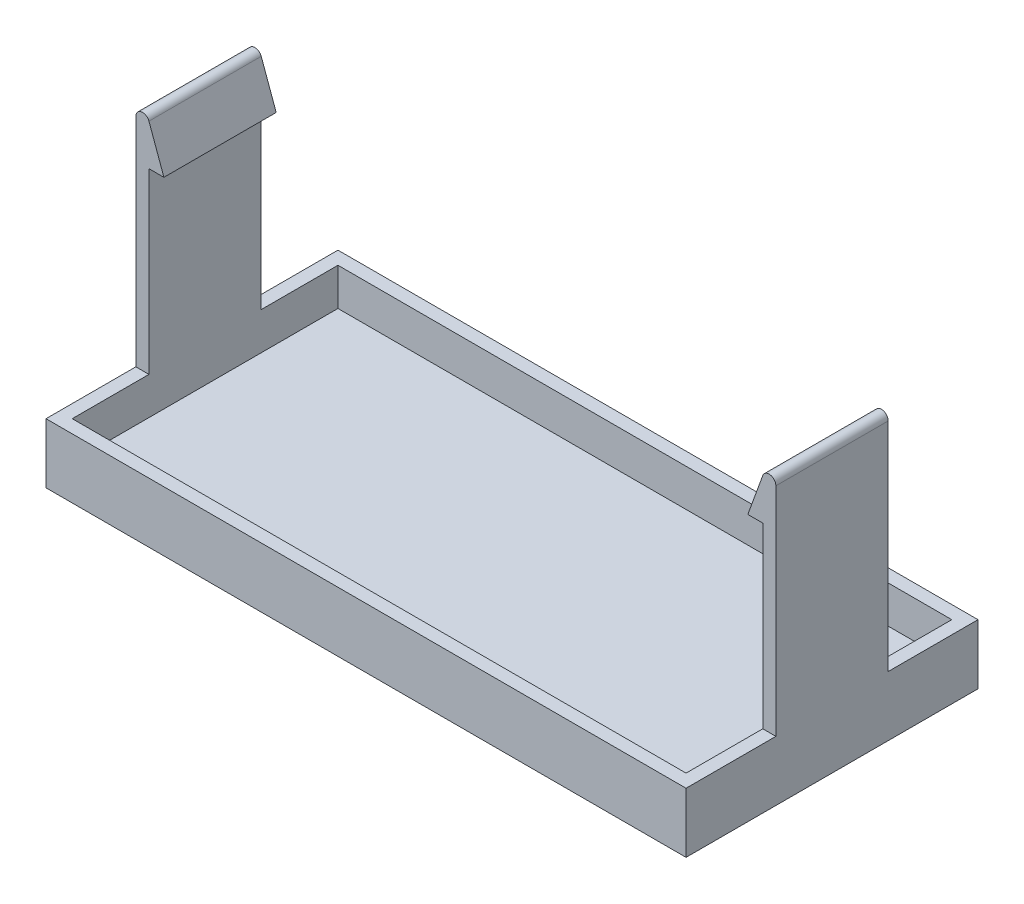
ISO-10303-21;
HEADER;
FILE_DESCRIPTION(('STEP AP214'),'2;1');
FILE_NAME('part.step','',(''),(''),'','','');
FILE_SCHEMA(('AUTOMOTIVE_DESIGN { 1 0 10303 214 1 1 1 1 }'));
ENDSEC;
DATA;
#1=APPLICATION_CONTEXT('core data for automotive mechanical design processes');
#2=APPLICATION_PROTOCOL_DEFINITION('international standard','automotive_design',2000,#1);
#3=PRODUCT_CONTEXT('',#1,'mechanical');
#4=PRODUCT('Part','Part','',(#3));
#5=PRODUCT_RELATED_PRODUCT_CATEGORY('part','',(#4));
#6=PRODUCT_DEFINITION_FORMATION('','',#4);
#7=PRODUCT_DEFINITION_CONTEXT('part definition',#1,'design');
#8=PRODUCT_DEFINITION('design','',#6,#7);
#9=PRODUCT_DEFINITION_SHAPE('','',#8);
#10=(LENGTH_UNIT() NAMED_UNIT(*) SI_UNIT(.MILLI.,.METRE.));
#11=(NAMED_UNIT(*) PLANE_ANGLE_UNIT() SI_UNIT($,.RADIAN.));
#12=(NAMED_UNIT(*) SI_UNIT($,.STERADIAN.) SOLID_ANGLE_UNIT());
#13=UNCERTAINTY_MEASURE_WITH_UNIT(LENGTH_MEASURE(1.E-05),#10,'distance_accuracy_value','');
#14=(GEOMETRIC_REPRESENTATION_CONTEXT(3) GLOBAL_UNCERTAINTY_ASSIGNED_CONTEXT((#13)) GLOBAL_UNIT_ASSIGNED_CONTEXT((#10,
#11,#12)) REPRESENTATION_CONTEXT('',''));
#15=CARTESIAN_POINT('',(0.,0.,0.));
#16=DIRECTION('',(0.,0.,1.));
#17=DIRECTION('',(1.,0.,0.));
#18=AXIS2_PLACEMENT_3D('',#15,#16,#17);
#19=CARTESIAN_POINT('',(0.,8.,0.));
#20=DIRECTION('',(0.,1.,0.));
#21=DIRECTION('',(0.,0.,1.));
#22=AXIS2_PLACEMENT_3D('',#19,#20,#21);
#23=PLANE('',#22);
#24=DIRECTION('',(0.,0.,-1.));
#25=VECTOR('',#24,1.);
#26=CARTESIAN_POINT('',(83.75,8.,-37.25));
#27=LINE('',#26,#25);
#28=CARTESIAN_POINT('',(83.75,8.,-27.));
#29=VERTEX_POINT('',#28);
#30=CARTESIAN_POINT('',(83.75,8.,-37.25));
#31=VERTEX_POINT('',#30);
#32=EDGE_CURVE('E309',#29,#31,#27,.T.);
#33=ORIENTED_EDGE('',*,*,#32,.F.);
#34=DIRECTION('',(-1.,0.,0.));
#35=VECTOR('',#34,1.);
#36=CARTESIAN_POINT('',(85.5,8.,-27.));
#37=LINE('',#36,#35);
#38=CARTESIAN_POINT('',(85.5,8.,-27.));
#39=VERTEX_POINT('',#38);
#40=EDGE_CURVE('E55',#39,#29,#37,.T.);
#41=ORIENTED_EDGE('',*,*,#40,.F.);
#42=DIRECTION('',(0.,0.,-1.));
#43=VECTOR('',#42,1.);
#44=CARTESIAN_POINT('',(85.5,8.,-39.));
#45=LINE('',#44,#43);
#46=CARTESIAN_POINT('',(85.5,8.,-39.));
#47=VERTEX_POINT('',#46);
#48=EDGE_CURVE('E353',#39,#47,#45,.T.);
#49=ORIENTED_EDGE('',*,*,#48,.T.);
#50=DIRECTION('',(-1.,0.,0.));
#51=VECTOR('',#50,1.);
#52=CARTESIAN_POINT('',(0.,8.,-39.));
#53=LINE('',#52,#51);
#54=CARTESIAN_POINT('',(0.,8.,-39.));
#55=VERTEX_POINT('',#54);
#56=EDGE_CURVE('E358',#47,#55,#53,.T.);
#57=ORIENTED_EDGE('',*,*,#56,.T.);
#58=DIRECTION('',(0.,0.,1.));
#59=VECTOR('',#58,1.);
#60=CARTESIAN_POINT('',(0.,8.,-39.));
#61=LINE('',#60,#59);
#62=CARTESIAN_POINT('',(0.,8.,-27.));
#63=VERTEX_POINT('',#62);
#64=EDGE_CURVE('E346',#55,#63,#61,.T.);
#65=ORIENTED_EDGE('',*,*,#64,.T.);
#66=DIRECTION('',(-1.,0.,0.));
#67=VECTOR('',#66,1.);
#68=CARTESIAN_POINT('',(0.,8.,-27.));
#69=LINE('',#68,#67);
#70=CARTESIAN_POINT('',(1.75,8.,-27.));
#71=VERTEX_POINT('',#70);
#72=EDGE_CURVE('E63',#71,#63,#69,.T.);
#73=ORIENTED_EDGE('',*,*,#72,.F.);
#74=DIRECTION('',(0.,0.,1.));
#75=VECTOR('',#74,1.);
#76=CARTESIAN_POINT('',(1.75,8.,-37.25));
#77=LINE('',#76,#75);
#78=CARTESIAN_POINT('',(1.75,8.,-37.25));
#79=VERTEX_POINT('',#78);
#80=EDGE_CURVE('E302',#79,#71,#77,.T.);
#81=ORIENTED_EDGE('',*,*,#80,.F.);
#82=DIRECTION('',(-1.,0.,0.));
#83=VECTOR('',#82,1.);
#84=CARTESIAN_POINT('',(1.75,8.,-37.25));
#85=LINE('',#84,#83);
#86=EDGE_CURVE('E314',#31,#79,#85,.T.);
#87=ORIENTED_EDGE('',*,*,#86,.F.);
#88=EDGE_LOOP('',(#33,#41,#49,#57,#65,#73,#81,#87));
#89=FACE_BOUND('',#88,.T.);
#90=ADVANCED_FACE('F39',(#89),#23,.T.);
#91=CARTESIAN_POINT('',(85.5,8.,0.));
#92=VERTEX_POINT('',#91);
#93=CARTESIAN_POINT('',(85.5,8.,-12.));
#94=VERTEX_POINT('',#93);
#95=EDGE_CURVE('E354',#92,#94,#45,.T.);
#96=ORIENTED_EDGE('',*,*,#95,.T.);
#97=DIRECTION('',(1.,0.,0.));
#98=VECTOR('',#97,1.);
#99=CARTESIAN_POINT('',(85.5,8.,-12.));
#100=LINE('',#99,#98);
#101=CARTESIAN_POINT('',(83.75,8.,-12.));
#102=VERTEX_POINT('',#101);
#103=EDGE_CURVE('E260',#102,#94,#100,.T.);
#104=ORIENTED_EDGE('',*,*,#103,.F.);
#105=CARTESIAN_POINT('',(83.75,8.,-1.75000000000002));
#106=VERTEX_POINT('',#105);
#107=EDGE_CURVE('E310',#106,#102,#27,.T.);
#108=ORIENTED_EDGE('',*,*,#107,.F.);
#109=DIRECTION('',(1.,0.,0.));
#110=VECTOR('',#109,1.);
#111=CARTESIAN_POINT('',(1.75,8.,-1.75000000000001));
#112=LINE('',#111,#110);
#113=CARTESIAN_POINT('',(1.75,8.,-1.75000000000001));
#114=VERTEX_POINT('',#113);
#115=EDGE_CURVE('E305',#114,#106,#112,.T.);
#116=ORIENTED_EDGE('',*,*,#115,.F.);
#117=CARTESIAN_POINT('',(1.75,8.,-12.));
#118=VERTEX_POINT('',#117);
#119=EDGE_CURVE('E306',#118,#114,#77,.T.);
#120=ORIENTED_EDGE('',*,*,#119,.F.);
#121=DIRECTION('',(1.,0.,0.));
#122=VECTOR('',#121,1.);
#123=CARTESIAN_POINT('',(0.,8.,-12.));
#124=LINE('',#123,#122);
#125=CARTESIAN_POINT('',(0.,8.,-12.));
#126=VERTEX_POINT('',#125);
#127=EDGE_CURVE('E275',#126,#118,#124,.T.);
#128=ORIENTED_EDGE('',*,*,#127,.F.);
#129=CARTESIAN_POINT('',(0.,8.,0.));
#130=VERTEX_POINT('',#129);
#131=EDGE_CURVE('E345',#126,#130,#61,.T.);
#132=ORIENTED_EDGE('',*,*,#131,.T.);
#133=DIRECTION('',(1.,0.,0.));
#134=VECTOR('',#133,1.);
#135=CARTESIAN_POINT('',(0.,8.,0.));
#136=LINE('',#135,#134);
#137=EDGE_CURVE('E349',#130,#92,#136,.T.);
#138=ORIENTED_EDGE('',*,*,#137,.T.);
#139=EDGE_LOOP('',(#96,#104,#108,#116,#120,#128,#132,#138));
#140=FACE_BOUND('',#139,.T.);
#141=ADVANCED_FACE('F427',(#140),#23,.T.);
#142=CARTESIAN_POINT('',(0.,3.,0.));
#143=DIRECTION('',(1.,0.,0.));
#144=DIRECTION('',(0.,0.,-1.));
#145=AXIS2_PLACEMENT_3D('',#142,#143,#144);
#146=PLANE('',#145);
#147=DIRECTION('',(0.,0.,1.));
#148=VECTOR('',#147,1.);
#149=CARTESIAN_POINT('',(0.,0.,0.));
#150=LINE('',#149,#148);
#151=CARTESIAN_POINT('',(0.,0.,-39.));
#152=VERTEX_POINT('',#151);
#153=CARTESIAN_POINT('',(0.,0.,0.));
#154=VERTEX_POINT('',#153);
#155=EDGE_CURVE('E362',#152,#154,#150,.T.);
#156=ORIENTED_EDGE('',*,*,#155,.T.);
#157=DIRECTION('',(0.,-1.,0.));
#158=VECTOR('',#157,1.);
#159=CARTESIAN_POINT('',(0.,3.,0.));
#160=LINE('',#159,#158);
#161=EDGE_CURVE('E11',#130,#154,#160,.T.);
#162=ORIENTED_EDGE('',*,*,#161,.F.);
#163=ORIENTED_EDGE('',*,*,#131,.F.);
#164=DIRECTION('',(0.,-1.,0.));
#165=VECTOR('',#164,1.);
#166=CARTESIAN_POINT('',(0.,31.8,-12.));
#167=LINE('',#166,#165);
#168=CARTESIAN_POINT('',(0.,36.9863826226695,-12.));
#169=VERTEX_POINT('',#168);
#170=EDGE_CURVE('E297',#169,#126,#167,.T.);
#171=ORIENTED_EDGE('',*,*,#170,.F.);
#172=DIRECTION('',(0.,0.,1.));
#173=VECTOR('',#172,1.);
#174=CARTESIAN_POINT('',(0.,36.9863826226695,-34.1507619767022));
#175=LINE('',#174,#173);
#176=CARTESIAN_POINT('',(0.,36.9863826226695,-27.));
#177=VERTEX_POINT('',#176);
#178=EDGE_CURVE('E228',#177,#169,#175,.T.);
#179=ORIENTED_EDGE('',*,*,#178,.F.);
#180=DIRECTION('',(0.,-1.,0.));
#181=VECTOR('',#180,1.);
#182=CARTESIAN_POINT('',(0.,31.8,-27.));
#183=LINE('',#182,#181);
#184=EDGE_CURVE('E280',#177,#63,#183,.T.);
#185=ORIENTED_EDGE('',*,*,#184,.T.);
#186=ORIENTED_EDGE('',*,*,#64,.F.);
#187=DIRECTION('',(0.,-1.,0.));
#188=VECTOR('',#187,1.);
#189=CARTESIAN_POINT('',(0.,3.,-39.));
#190=LINE('',#189,#188);
#191=EDGE_CURVE('E375',#55,#152,#190,.T.);
#192=ORIENTED_EDGE('',*,*,#191,.T.);
#193=EDGE_LOOP('',(#156,#162,#163,#171,#179,#185,#186,#192));
#194=FACE_BOUND('',#193,.T.);
#195=ADVANCED_FACE('F41',(#194),#146,.F.);
#196=CARTESIAN_POINT('',(0.,3.,0.));
#197=DIRECTION('',(0.,0.,-1.));
#198=DIRECTION('',(-1.,0.,0.));
#199=AXIS2_PLACEMENT_3D('',#196,#197,#198);
#200=PLANE('',#199);
#201=DIRECTION('',(1.,0.,0.));
#202=VECTOR('',#201,1.);
#203=CARTESIAN_POINT('',(0.,0.,0.));
#204=LINE('',#203,#202);
#205=CARTESIAN_POINT('',(85.5,0.,0.));
#206=VERTEX_POINT('',#205);
#207=EDGE_CURVE('E366',#154,#206,#204,.T.);
#208=ORIENTED_EDGE('',*,*,#207,.T.);
#209=DIRECTION('',(0.,-1.,0.));
#210=VECTOR('',#209,1.);
#211=CARTESIAN_POINT('',(85.5,3.,0.));
#212=LINE('',#211,#210);
#213=EDGE_CURVE('E48',#92,#206,#212,.T.);
#214=ORIENTED_EDGE('',*,*,#213,.F.);
#215=ORIENTED_EDGE('',*,*,#137,.F.);
#216=ORIENTED_EDGE('',*,*,#161,.T.);
#217=EDGE_LOOP('',(#208,#214,#215,#216));
#218=FACE_BOUND('',#217,.T.);
#219=ADVANCED_FACE('F461',(#218),#200,.F.);
#220=CARTESIAN_POINT('',(85.5,3.,0.));
#221=DIRECTION('',(-1.,0.,0.));
#222=DIRECTION('',(0.,0.,1.));
#223=AXIS2_PLACEMENT_3D('',#220,#221,#222);
#224=PLANE('',#223);
#225=DIRECTION('',(0.,0.,-1.));
#226=VECTOR('',#225,1.);
#227=CARTESIAN_POINT('',(85.5,0.,0.));
#228=LINE('',#227,#226);
#229=CARTESIAN_POINT('',(85.5,0.,-39.));
#230=VERTEX_POINT('',#229);
#231=EDGE_CURVE('E369',#206,#230,#228,.T.);
#232=ORIENTED_EDGE('',*,*,#231,.T.);
#233=DIRECTION('',(0.,-1.,0.));
#234=VECTOR('',#233,1.);
#235=CARTESIAN_POINT('',(85.5,3.,-39.));
#236=LINE('',#235,#234);
#237=EDGE_CURVE('E379',#47,#230,#236,.T.);
#238=ORIENTED_EDGE('',*,*,#237,.F.);
#239=ORIENTED_EDGE('',*,*,#48,.F.);
#240=DIRECTION('',(0.,-1.,0.));
#241=VECTOR('',#240,1.);
#242=CARTESIAN_POINT('',(85.5,31.8,-27.));
#243=LINE('',#242,#241);
#244=CARTESIAN_POINT('',(85.5,36.9863826226695,-27.));
#245=VERTEX_POINT('',#244);
#246=EDGE_CURVE('E259',#245,#39,#243,.T.);
#247=ORIENTED_EDGE('',*,*,#246,.F.);
#248=DIRECTION('',(0.,0.,1.));
#249=VECTOR('',#248,1.);
#250=CARTESIAN_POINT('',(85.5,36.9863826226695,-34.1507619767022));
#251=LINE('',#250,#249);
#252=CARTESIAN_POINT('',(85.5,36.9863826226695,-12.));
#253=VERTEX_POINT('',#252);
#254=EDGE_CURVE('E214',#245,#253,#251,.T.);
#255=ORIENTED_EDGE('',*,*,#254,.T.);
#256=DIRECTION('',(0.,-1.,0.));
#257=VECTOR('',#256,1.);
#258=CARTESIAN_POINT('',(85.5,31.8,-12.));
#259=LINE('',#258,#257);
#260=EDGE_CURVE('E205',#253,#94,#259,.T.);
#261=ORIENTED_EDGE('',*,*,#260,.T.);
#262=ORIENTED_EDGE('',*,*,#95,.F.);
#263=ORIENTED_EDGE('',*,*,#213,.T.);
#264=EDGE_LOOP('',(#232,#238,#239,#247,#255,#261,#262,#263));
#265=FACE_BOUND('',#264,.T.);
#266=ADVANCED_FACE('F387',(#265),#224,.F.);
#267=CARTESIAN_POINT('',(0.,3.,-39.));
#268=DIRECTION('',(0.,0.,1.));
#269=DIRECTION('',(1.,0.,0.));
#270=AXIS2_PLACEMENT_3D('',#267,#268,#269);
#271=PLANE('',#270);
#272=DIRECTION('',(-1.,0.,0.));
#273=VECTOR('',#272,1.);
#274=CARTESIAN_POINT('',(0.,0.,-39.));
#275=LINE('',#274,#273);
#276=EDGE_CURVE('E372',#230,#152,#275,.T.);
#277=ORIENTED_EDGE('',*,*,#276,.T.);
#278=ORIENTED_EDGE('',*,*,#191,.F.);
#279=ORIENTED_EDGE('',*,*,#56,.F.);
#280=ORIENTED_EDGE('',*,*,#237,.T.);
#281=EDGE_LOOP('',(#277,#278,#279,#280));
#282=FACE_BOUND('',#281,.T.);
#283=ADVANCED_FACE('F396',(#282),#271,.F.);
#284=CARTESIAN_POINT('',(0.,0.,0.));
#285=DIRECTION('',(0.,-1.,0.));
#286=DIRECTION('',(0.,0.,-1.));
#287=AXIS2_PLACEMENT_3D('',#284,#285,#286);
#288=PLANE('',#287);
#289=ORIENTED_EDGE('',*,*,#155,.F.);
#290=ORIENTED_EDGE('',*,*,#276,.F.);
#291=ORIENTED_EDGE('',*,*,#231,.F.);
#292=ORIENTED_EDGE('',*,*,#207,.F.);
#293=EDGE_LOOP('',(#289,#290,#291,#292));
#294=FACE_BOUND('',#293,.T.);
#295=ADVANCED_FACE('F394',(#294),#288,.T.);
#296=CARTESIAN_POINT('',(1.75,8.,-37.25));
#297=DIRECTION('',(1.,0.,0.));
#298=DIRECTION('',(0.,0.,-1.));
#299=AXIS2_PLACEMENT_3D('',#296,#297,#298);
#300=PLANE('',#299);
#301=DIRECTION('',(0.,0.,1.));
#302=VECTOR('',#301,1.);
#303=CARTESIAN_POINT('',(1.75,3.,-37.25));
#304=LINE('',#303,#302);
#305=CARTESIAN_POINT('',(1.75,3.,-37.25));
#306=VERTEX_POINT('',#305);
#307=CARTESIAN_POINT('',(1.75,3.,-1.75000000000001));
#308=VERTEX_POINT('',#307);
#309=EDGE_CURVE('E301',#306,#308,#304,.T.);
#310=ORIENTED_EDGE('',*,*,#309,.F.);
#311=DIRECTION('',(0.,-1.,0.));
#312=VECTOR('',#311,1.);
#313=CARTESIAN_POINT('',(1.75,8.,-37.25));
#314=LINE('',#313,#312);
#315=EDGE_CURVE('E317',#79,#306,#314,.T.);
#316=ORIENTED_EDGE('',*,*,#315,.F.);
#317=ORIENTED_EDGE('',*,*,#80,.T.);
#318=DIRECTION('',(0.,-1.,0.));
#319=VECTOR('',#318,1.);
#320=CARTESIAN_POINT('',(1.75,31.8,-27.));
#321=LINE('',#320,#319);
#322=CARTESIAN_POINT('',(1.75,31.8,-27.));
#323=VERTEX_POINT('',#322);
#324=EDGE_CURVE('E289',#323,#71,#321,.T.);
#325=ORIENTED_EDGE('',*,*,#324,.F.);
#326=DIRECTION('',(0.,0.,-1.));
#327=VECTOR('',#326,1.);
#328=CARTESIAN_POINT('',(1.75,31.8,-27.));
#329=LINE('',#328,#327);
#330=CARTESIAN_POINT('',(1.75,31.8,-12.));
#331=VERTEX_POINT('',#330);
#332=EDGE_CURVE('E276',#331,#323,#329,.T.);
#333=ORIENTED_EDGE('',*,*,#332,.F.);
#334=DIRECTION('',(0.,-1.,0.));
#335=VECTOR('',#334,1.);
#336=CARTESIAN_POINT('',(1.75,31.8,-12.));
#337=LINE('',#336,#335);
#338=EDGE_CURVE('E293',#331,#118,#337,.T.);
#339=ORIENTED_EDGE('',*,*,#338,.T.);
#340=ORIENTED_EDGE('',*,*,#119,.T.);
#341=DIRECTION('',(0.,-1.,0.));
#342=VECTOR('',#341,1.);
#343=CARTESIAN_POINT('',(1.75,8.,-1.75000000000001));
#344=LINE('',#343,#342);
#345=EDGE_CURVE('E341',#114,#308,#344,.T.);
#346=ORIENTED_EDGE('',*,*,#345,.T.);
#347=EDGE_LOOP('',(#310,#316,#317,#325,#333,#339,#340,#346));
#348=FACE_BOUND('',#347,.T.);
#349=ADVANCED_FACE('F410',(#348),#300,.T.);
#350=CARTESIAN_POINT('',(1.75,8.,-1.75000000000001));
#351=DIRECTION('',(0.,0.,-1.));
#352=DIRECTION('',(-1.,0.,0.));
#353=AXIS2_PLACEMENT_3D('',#350,#351,#352);
#354=PLANE('',#353);
#355=DIRECTION('',(1.,0.,0.));
#356=VECTOR('',#355,1.);
#357=CARTESIAN_POINT('',(1.75,3.,-1.75000000000001));
#358=LINE('',#357,#356);
#359=CARTESIAN_POINT('',(83.75,3.,-1.75000000000002));
#360=VERTEX_POINT('',#359);
#361=EDGE_CURVE('E321',#308,#360,#358,.T.);
#362=ORIENTED_EDGE('',*,*,#361,.F.);
#363=ORIENTED_EDGE('',*,*,#345,.F.);
#364=ORIENTED_EDGE('',*,*,#115,.T.);
#365=DIRECTION('',(0.,-1.,0.));
#366=VECTOR('',#365,1.);
#367=CARTESIAN_POINT('',(83.75,8.,-1.75000000000002));
#368=LINE('',#367,#366);
#369=EDGE_CURVE('E338',#106,#360,#368,.T.);
#370=ORIENTED_EDGE('',*,*,#369,.T.);
#371=EDGE_LOOP('',(#362,#363,#364,#370));
#372=FACE_BOUND('',#371,.T.);
#373=ADVANCED_FACE('F424',(#372),#354,.T.);
#374=CARTESIAN_POINT('',(83.75,8.,-37.25));
#375=DIRECTION('',(-1.,0.,0.));
#376=DIRECTION('',(0.,0.,1.));
#377=AXIS2_PLACEMENT_3D('',#374,#375,#376);
#378=PLANE('',#377);
#379=DIRECTION('',(0.,0.,-1.));
#380=VECTOR('',#379,1.);
#381=CARTESIAN_POINT('',(83.75,3.,-37.25));
#382=LINE('',#381,#380);
#383=CARTESIAN_POINT('',(83.75,3.,-37.25));
#384=VERTEX_POINT('',#383);
#385=EDGE_CURVE('E325',#360,#384,#382,.T.);
#386=ORIENTED_EDGE('',*,*,#385,.F.);
#387=ORIENTED_EDGE('',*,*,#369,.F.);
#388=ORIENTED_EDGE('',*,*,#107,.T.);
#389=DIRECTION('',(0.,-1.,0.));
#390=VECTOR('',#389,1.);
#391=CARTESIAN_POINT('',(83.75,31.8,-12.));
#392=LINE('',#391,#390);
#393=CARTESIAN_POINT('',(83.75,31.8,-12.));
#394=VERTEX_POINT('',#393);
#395=EDGE_CURVE('E269',#394,#102,#392,.T.);
#396=ORIENTED_EDGE('',*,*,#395,.F.);
#397=DIRECTION('',(0.,0.,1.));
#398=VECTOR('',#397,1.);
#399=CARTESIAN_POINT('',(83.75,31.8,-27.));
#400=LINE('',#399,#398);
#401=CARTESIAN_POINT('',(83.75,31.8,-27.));
#402=VERTEX_POINT('',#401);
#403=EDGE_CURVE('E255',#402,#394,#400,.T.);
#404=ORIENTED_EDGE('',*,*,#403,.F.);
#405=DIRECTION('',(0.,-1.,0.));
#406=VECTOR('',#405,1.);
#407=CARTESIAN_POINT('',(83.75,31.8,-27.));
#408=LINE('',#407,#406);
#409=EDGE_CURVE('E272',#402,#29,#408,.T.);
#410=ORIENTED_EDGE('',*,*,#409,.T.);
#411=ORIENTED_EDGE('',*,*,#32,.T.);
#412=DIRECTION('',(0.,-1.,0.));
#413=VECTOR('',#412,1.);
#414=CARTESIAN_POINT('',(83.75,8.,-37.25));
#415=LINE('',#414,#413);
#416=EDGE_CURVE('E335',#31,#384,#415,.T.);
#417=ORIENTED_EDGE('',*,*,#416,.T.);
#418=EDGE_LOOP('',(#386,#387,#388,#396,#404,#410,#411,#417));
#419=FACE_BOUND('',#418,.T.);
#420=ADVANCED_FACE('F431',(#419),#378,.T.);
#421=CARTESIAN_POINT('',(1.75,8.,-37.25));
#422=DIRECTION('',(0.,0.,1.));
#423=DIRECTION('',(1.,0.,0.));
#424=AXIS2_PLACEMENT_3D('',#421,#422,#423);
#425=PLANE('',#424);
#426=DIRECTION('',(-1.,0.,0.));
#427=VECTOR('',#426,1.);
#428=CARTESIAN_POINT('',(1.75,3.,-37.25));
#429=LINE('',#428,#427);
#430=EDGE_CURVE('E329',#384,#306,#429,.T.);
#431=ORIENTED_EDGE('',*,*,#430,.F.);
#432=ORIENTED_EDGE('',*,*,#416,.F.);
#433=ORIENTED_EDGE('',*,*,#86,.T.);
#434=ORIENTED_EDGE('',*,*,#315,.T.);
#435=EDGE_LOOP('',(#431,#432,#433,#434));
#436=FACE_BOUND('',#435,.T.);
#437=ADVANCED_FACE('F438',(#436),#425,.T.);
#438=CARTESIAN_POINT('',(0.,3.,0.));
#439=DIRECTION('',(0.,-1.,0.));
#440=DIRECTION('',(0.,0.,-1.));
#441=AXIS2_PLACEMENT_3D('',#438,#439,#440);
#442=PLANE('',#441);
#443=ORIENTED_EDGE('',*,*,#430,.T.);
#444=ORIENTED_EDGE('',*,*,#309,.T.);
#445=ORIENTED_EDGE('',*,*,#361,.T.);
#446=ORIENTED_EDGE('',*,*,#385,.T.);
#447=EDGE_LOOP('',(#443,#444,#445,#446));
#448=FACE_BOUND('',#447,.T.);
#449=ADVANCED_FACE('F435',(#448),#442,.F.);
#450=CARTESIAN_POINT('',(0.,31.8,-12.));
#451=DIRECTION('',(0.,0.,-1.));
#452=DIRECTION('',(-1.,0.,0.));
#453=AXIS2_PLACEMENT_3D('',#450,#451,#452);
#454=PLANE('',#453);
#455=ORIENTED_EDGE('',*,*,#127,.T.);
#456=ORIENTED_EDGE('',*,*,#338,.F.);
#457=DIRECTION('',(1.,0.,0.));
#458=VECTOR('',#457,1.);
#459=CARTESIAN_POINT('',(1.75,31.8,-12.));
#460=LINE('',#459,#458);
#461=CARTESIAN_POINT('',(3.75,31.8,-12.));
#462=VERTEX_POINT('',#461);
#463=EDGE_CURVE('E223',#331,#462,#460,.T.);
#464=ORIENTED_EDGE('',*,*,#463,.T.);
#465=DIRECTION('',(-0.342020143325663,0.939692620785911,0.));
#466=VECTOR('',#465,1.);
#467=CARTESIAN_POINT('',(3.75,31.8,-12.));
#468=LINE('',#467,#466);
#469=CARTESIAN_POINT('',(1.75,37.2949548389093,-12.));
#470=VERTEX_POINT('',#469);
#471=EDGE_CURVE('E234',#462,#470,#468,.T.);
#472=ORIENTED_EDGE('',*,*,#471,.T.);
#473=CARTESIAN_POINT('',(0.902204803610044,36.9863826226695,-12.));
#474=DIRECTION('',(0.,0.,1.));
#475=DIRECTION('',(1.,0.,0.));
#476=AXIS2_PLACEMENT_3D('',#473,#474,#475);
#477=CIRCLE('',#476,0.902204803610044);
#478=EDGE_CURVE('E238',#470,#169,#477,.T.);
#479=ORIENTED_EDGE('',*,*,#478,.T.);
#480=ORIENTED_EDGE('',*,*,#170,.T.);
#481=EDGE_LOOP('',(#455,#456,#464,#472,#479,#480));
#482=FACE_BOUND('',#481,.T.);
#483=ADVANCED_FACE('F418',(#482),#454,.F.);
#484=CARTESIAN_POINT('',(0.,31.8,-27.));
#485=DIRECTION('',(0.,0.,1.));
#486=DIRECTION('',(1.,0.,0.));
#487=AXIS2_PLACEMENT_3D('',#484,#485,#486);
#488=PLANE('',#487);
#489=ORIENTED_EDGE('',*,*,#72,.T.);
#490=ORIENTED_EDGE('',*,*,#184,.F.);
#491=CARTESIAN_POINT('',(0.902204803610044,36.9863826226695,-27.));
#492=DIRECTION('',(0.,0.,1.));
#493=DIRECTION('',(1.,0.,0.));
#494=AXIS2_PLACEMENT_3D('',#491,#492,#493);
#495=CIRCLE('',#494,0.902204803610044);
#496=CARTESIAN_POINT('',(1.75,37.2949548389093,-27.));
#497=VERTEX_POINT('',#496);
#498=EDGE_CURVE('E227',#177,#497,#495,.F.);
#499=ORIENTED_EDGE('',*,*,#498,.T.);
#500=DIRECTION('',(0.342020143325663,-0.939692620785911,0.));
#501=VECTOR('',#500,1.);
#502=CARTESIAN_POINT('',(3.75,31.8,-27.));
#503=LINE('',#502,#501);
#504=CARTESIAN_POINT('',(3.75,31.8,-27.));
#505=VERTEX_POINT('',#504);
#506=EDGE_CURVE('E224',#497,#505,#503,.T.);
#507=ORIENTED_EDGE('',*,*,#506,.T.);
#508=DIRECTION('',(-1.,0.,0.));
#509=VECTOR('',#508,1.);
#510=CARTESIAN_POINT('',(1.75,31.8,-27.));
#511=LINE('',#510,#509);
#512=EDGE_CURVE('E231',#505,#323,#511,.T.);
#513=ORIENTED_EDGE('',*,*,#512,.T.);
#514=ORIENTED_EDGE('',*,*,#324,.T.);
#515=EDGE_LOOP('',(#489,#490,#499,#507,#513,#514));
#516=FACE_BOUND('',#515,.T.);
#517=ADVANCED_FACE('F404',(#516),#488,.F.);
#518=CARTESIAN_POINT('',(85.5,31.8,-27.));
#519=DIRECTION('',(0.,0.,1.));
#520=DIRECTION('',(1.,0.,0.));
#521=AXIS2_PLACEMENT_3D('',#518,#519,#520);
#522=PLANE('',#521);
#523=ORIENTED_EDGE('',*,*,#40,.T.);
#524=ORIENTED_EDGE('',*,*,#409,.F.);
#525=DIRECTION('',(-1.,0.,0.));
#526=VECTOR('',#525,1.);
#527=CARTESIAN_POINT('',(83.75,31.8,-27.));
#528=LINE('',#527,#526);
#529=CARTESIAN_POINT('',(81.75,31.8,-27.));
#530=VERTEX_POINT('',#529);
#531=EDGE_CURVE('E217',#402,#530,#528,.T.);
#532=ORIENTED_EDGE('',*,*,#531,.T.);
#533=DIRECTION('',(0.342020143325663,0.93969262078591,0.));
#534=VECTOR('',#533,1.);
#535=CARTESIAN_POINT('',(81.75,31.8,-27.));
#536=LINE('',#535,#534);
#537=CARTESIAN_POINT('',(83.75,37.2949548389093,-27.));
#538=VERTEX_POINT('',#537);
#539=EDGE_CURVE('E220',#530,#538,#536,.T.);
#540=ORIENTED_EDGE('',*,*,#539,.T.);
#541=CARTESIAN_POINT('',(84.59779519639,36.9863826226695,-27.));
#542=DIRECTION('',(0.,0.,1.));
#543=DIRECTION('',(1.,0.,0.));
#544=AXIS2_PLACEMENT_3D('',#541,#542,#543);
#545=CIRCLE('',#544,0.902204803610043);
#546=EDGE_CURVE('E187',#538,#245,#545,.F.);
#547=ORIENTED_EDGE('',*,*,#546,.T.);
#548=ORIENTED_EDGE('',*,*,#246,.T.);
#549=EDGE_LOOP('',(#523,#524,#532,#540,#547,#548));
#550=FACE_BOUND('',#549,.T.);
#551=ADVANCED_FACE('F487',(#550),#522,.F.);
#552=CARTESIAN_POINT('',(85.5,31.8,-12.));
#553=DIRECTION('',(0.,0.,-1.));
#554=DIRECTION('',(-1.,0.,0.));
#555=AXIS2_PLACEMENT_3D('',#552,#553,#554);
#556=PLANE('',#555);
#557=ORIENTED_EDGE('',*,*,#103,.T.);
#558=ORIENTED_EDGE('',*,*,#260,.F.);
#559=CARTESIAN_POINT('',(84.59779519639,36.9863826226695,-12.));
#560=DIRECTION('',(0.,0.,1.));
#561=DIRECTION('',(-1.,0.,0.));
#562=AXIS2_PLACEMENT_3D('',#559,#560,#561);
#563=CIRCLE('',#562,0.902204803610043);
#564=CARTESIAN_POINT('',(83.75,37.2949548389093,-12.));
#565=VERTEX_POINT('',#564);
#566=EDGE_CURVE('E185',#253,#565,#563,.T.);
#567=ORIENTED_EDGE('',*,*,#566,.T.);
#568=DIRECTION('',(-0.342020143325663,-0.93969262078591,0.));
#569=VECTOR('',#568,1.);
#570=CARTESIAN_POINT('',(81.75,31.8,-12.));
#571=LINE('',#570,#569);
#572=CARTESIAN_POINT('',(81.75,31.8,-12.));
#573=VERTEX_POINT('',#572);
#574=EDGE_CURVE('E195',#565,#573,#571,.T.);
#575=ORIENTED_EDGE('',*,*,#574,.T.);
#576=DIRECTION('',(1.,0.,0.));
#577=VECTOR('',#576,1.);
#578=CARTESIAN_POINT('',(83.75,31.8,-12.));
#579=LINE('',#578,#577);
#580=EDGE_CURVE('E192',#573,#394,#579,.T.);
#581=ORIENTED_EDGE('',*,*,#580,.T.);
#582=ORIENTED_EDGE('',*,*,#395,.T.);
#583=EDGE_LOOP('',(#557,#558,#567,#575,#581,#582));
#584=FACE_BOUND('',#583,.T.);
#585=ADVANCED_FACE('F203',(#584),#556,.F.);
#586=CARTESIAN_POINT('',(0.902204803610044,36.9863826226695,-34.1507619767022));
#587=DIRECTION('',(0.,0.,1.));
#588=DIRECTION('',(1.,0.,0.));
#589=AXIS2_PLACEMENT_3D('',#586,#587,#588);
#590=CYLINDRICAL_SURFACE('',#589,0.902204803610044);
#591=ORIENTED_EDGE('',*,*,#498,.F.);
#592=ORIENTED_EDGE('',*,*,#178,.T.);
#593=ORIENTED_EDGE('',*,*,#478,.F.);
#594=DIRECTION('',(0.,0.,1.));
#595=VECTOR('',#594,1.);
#596=CARTESIAN_POINT('',(1.75,37.2949548389093,-34.1507619767022));
#597=LINE('',#596,#595);
#598=EDGE_CURVE('E246',#497,#470,#597,.T.);
#599=ORIENTED_EDGE('',*,*,#598,.F.);
#600=EDGE_LOOP('',(#591,#592,#593,#599));
#601=FACE_BOUND('',#600,.T.);
#602=ADVANCED_FACE('F471',(#601),#590,.T.);
#603=CARTESIAN_POINT('',(3.75,31.8,-34.1507619767022));
#604=DIRECTION('',(0.93969262078591,0.342020143325663,0.));
#605=DIRECTION('',(-0.342020143325663,0.939692620785911,0.));
#606=AXIS2_PLACEMENT_3D('',#603,#604,#605);
#607=PLANE('',#606);
#608=ORIENTED_EDGE('',*,*,#506,.F.);
#609=ORIENTED_EDGE('',*,*,#598,.T.);
#610=ORIENTED_EDGE('',*,*,#471,.F.);
#611=DIRECTION('',(0.,0.,1.));
#612=VECTOR('',#611,1.);
#613=CARTESIAN_POINT('',(3.75,31.8,-34.1507619767022));
#614=LINE('',#613,#612);
#615=EDGE_CURVE('E242',#505,#462,#614,.T.);
#616=ORIENTED_EDGE('',*,*,#615,.F.);
#617=EDGE_LOOP('',(#608,#609,#610,#616));
#618=FACE_BOUND('',#617,.T.);
#619=ADVANCED_FACE('F474',(#618),#607,.T.);
#620=CARTESIAN_POINT('',(1.75,31.8,-34.1507619767022));
#621=DIRECTION('',(0.,-1.,0.));
#622=DIRECTION('',(0.,0.,-1.));
#623=AXIS2_PLACEMENT_3D('',#620,#621,#622);
#624=PLANE('',#623);
#625=ORIENTED_EDGE('',*,*,#463,.F.);
#626=ORIENTED_EDGE('',*,*,#332,.T.);
#627=ORIENTED_EDGE('',*,*,#512,.F.);
#628=ORIENTED_EDGE('',*,*,#615,.T.);
#629=EDGE_LOOP('',(#625,#626,#627,#628));
#630=FACE_BOUND('',#629,.T.);
#631=ADVANCED_FACE('F414',(#630),#624,.T.);
#632=CARTESIAN_POINT('',(84.59779519639,36.9863826226695,-34.1507619767022));
#633=DIRECTION('',(0.,0.,1.));
#634=DIRECTION('',(1.,0.,0.));
#635=AXIS2_PLACEMENT_3D('',#632,#633,#634);
#636=CYLINDRICAL_SURFACE('',#635,0.902204803610043);
#637=ORIENTED_EDGE('',*,*,#546,.F.);
#638=DIRECTION('',(0.,0.,1.));
#639=VECTOR('',#638,1.);
#640=CARTESIAN_POINT('',(83.75,37.2949548389093,-34.1507619767022));
#641=LINE('',#640,#639);
#642=EDGE_CURVE('E180',#538,#565,#641,.T.);
#643=ORIENTED_EDGE('',*,*,#642,.T.);
#644=ORIENTED_EDGE('',*,*,#566,.F.);
#645=ORIENTED_EDGE('',*,*,#254,.F.);
#646=EDGE_LOOP('',(#637,#643,#644,#645));
#647=FACE_BOUND('',#646,.T.);
#648=ADVANCED_FACE('F182',(#647),#636,.T.);
#649=CARTESIAN_POINT('',(83.75,31.8,-34.1507619767022));
#650=DIRECTION('',(0.,-1.,0.));
#651=DIRECTION('',(0.,0.,-1.));
#652=AXIS2_PLACEMENT_3D('',#649,#650,#651);
#653=PLANE('',#652);
#654=ORIENTED_EDGE('',*,*,#531,.F.);
#655=ORIENTED_EDGE('',*,*,#403,.T.);
#656=ORIENTED_EDGE('',*,*,#580,.F.);
#657=DIRECTION('',(0.,0.,1.));
#658=VECTOR('',#657,1.);
#659=CARTESIAN_POINT('',(81.75,31.8,-34.1507619767022));
#660=LINE('',#659,#658);
#661=EDGE_CURVE('E191',#530,#573,#660,.T.);
#662=ORIENTED_EDGE('',*,*,#661,.F.);
#663=EDGE_LOOP('',(#654,#655,#656,#662));
#664=FACE_BOUND('',#663,.T.);
#665=ADVANCED_FACE('F533',(#664),#653,.T.);
#666=CARTESIAN_POINT('',(81.75,31.8,-34.1507619767022));
#667=DIRECTION('',(-0.93969262078591,0.342020143325663,0.));
#668=DIRECTION('',(-0.342020143325663,-0.93969262078591,0.));
#669=AXIS2_PLACEMENT_3D('',#666,#667,#668);
#670=PLANE('',#669);
#671=ORIENTED_EDGE('',*,*,#539,.F.);
#672=ORIENTED_EDGE('',*,*,#661,.T.);
#673=ORIENTED_EDGE('',*,*,#574,.F.);
#674=ORIENTED_EDGE('',*,*,#642,.F.);
#675=EDGE_LOOP('',(#671,#672,#673,#674));
#676=FACE_BOUND('',#675,.T.);
#677=ADVANCED_FACE('F196',(#676),#670,.T.);
#678=CLOSED_SHELL('',(#90,#141,#195,#219,#266,#283,#295,#349,#373,#420,#437,#449,#483,#517,#551,
#585,#602,#619,#631,#648,#665,#677));
#679=MANIFOLD_SOLID_BREP('B2',#678);
#680=ADVANCED_BREP_SHAPE_REPRESENTATION('',(#18,#679),#14);
#681=SHAPE_DEFINITION_REPRESENTATION(#9,#680);
ENDSEC;
END-ISO-10303-21;
